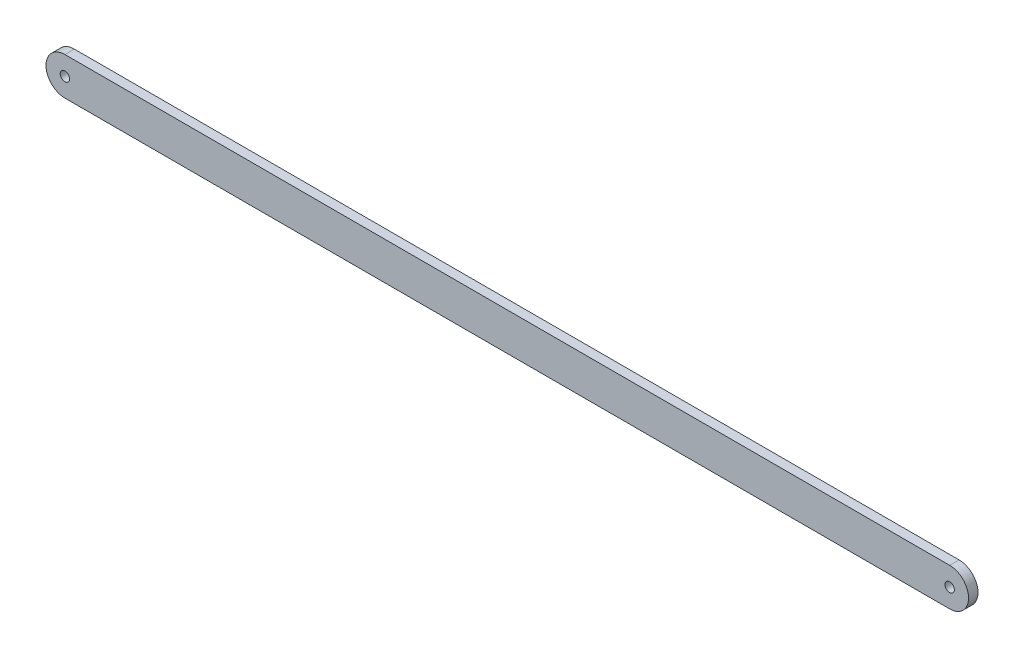
ISO-10303-21;
HEADER;
FILE_DESCRIPTION(('STEP AP214'),'2;1');
FILE_NAME('part.step','',(''),(''),'','','');
FILE_SCHEMA(('AUTOMOTIVE_DESIGN { 1 0 10303 214 1 1 1 1 }'));
ENDSEC;
DATA;
#1=APPLICATION_CONTEXT('core data for automotive mechanical design processes');
#2=APPLICATION_PROTOCOL_DEFINITION('international standard','automotive_design',2000,#1);
#3=PRODUCT_CONTEXT('',#1,'mechanical');
#4=PRODUCT('Part','Part','',(#3));
#5=PRODUCT_RELATED_PRODUCT_CATEGORY('part','',(#4));
#6=PRODUCT_DEFINITION_FORMATION('','',#4);
#7=PRODUCT_DEFINITION_CONTEXT('part definition',#1,'design');
#8=PRODUCT_DEFINITION('design','',#6,#7);
#9=PRODUCT_DEFINITION_SHAPE('','',#8);
#10=(LENGTH_UNIT() NAMED_UNIT(*) SI_UNIT(.MILLI.,.METRE.));
#11=(NAMED_UNIT(*) PLANE_ANGLE_UNIT() SI_UNIT($,.RADIAN.));
#12=(NAMED_UNIT(*) SI_UNIT($,.STERADIAN.) SOLID_ANGLE_UNIT());
#13=UNCERTAINTY_MEASURE_WITH_UNIT(LENGTH_MEASURE(1.E-05),#10,'distance_accuracy_value','');
#14=(GEOMETRIC_REPRESENTATION_CONTEXT(3) GLOBAL_UNCERTAINTY_ASSIGNED_CONTEXT((#13)) GLOBAL_UNIT_ASSIGNED_CONTEXT((#10,
#11,#12)) REPRESENTATION_CONTEXT('',''));
#15=CARTESIAN_POINT('',(0.,0.,0.));
#16=DIRECTION('',(0.,0.,1.));
#17=DIRECTION('',(1.,0.,0.));
#18=AXIS2_PLACEMENT_3D('',#15,#16,#17);
#19=CARTESIAN_POINT('',(-150.,2.22044604925031E-13,1.6));
#20=DIRECTION('',(0.,0.,1.));
#21=DIRECTION('',(1.,0.,0.));
#22=AXIS2_PLACEMENT_3D('',#19,#20,#21);
#23=PLANE('',#22);
#24=CARTESIAN_POINT('',(-150.,2.22044604925031E-13,1.6));
#25=DIRECTION('',(0.,0.,1.));
#26=DIRECTION('',(1.,0.,0.));
#27=AXIS2_PLACEMENT_3D('',#24,#25,#26);
#28=CIRCLE('',#27,1.58750000000007);
#29=CARTESIAN_POINT('',(-148.4125,2.22044604925031E-13,1.6));
#30=VERTEX_POINT('',#29);
#31=EDGE_CURVE('E100',#30,#30,#28,.T.);
#32=ORIENTED_EDGE('',*,*,#31,.F.);
#33=EDGE_LOOP('',(#32));
#34=FACE_BOUND('',#33,.T.);
#35=CARTESIAN_POINT('',(-150.,2.22044604925031E-13,1.6));
#36=DIRECTION('',(0.,0.,1.));
#37=DIRECTION('',(1.,0.,0.));
#38=AXIS2_PLACEMENT_3D('',#35,#36,#37);
#39=CIRCLE('',#38,6.39999999999999);
#40=CARTESIAN_POINT('',(-150.000000000176,6.40000000000018,1.6));
#41=VERTEX_POINT('',#40);
#42=CARTESIAN_POINT('',(-150.000026079066,-6.39999999994667,1.6));
#43=VERTEX_POINT('',#42);
#44=EDGE_CURVE('E85',#41,#43,#39,.T.);
#45=ORIENTED_EDGE('',*,*,#44,.T.);
#46=DIRECTION('',(1.,0.,0.));
#47=VECTOR('',#46,1.);
#48=CARTESIAN_POINT('',(-150.000026079066,-6.39999999994667,1.6));
#49=LINE('',#48,#47);
#50=CARTESIAN_POINT('',(150.000026079047,-6.39999999994662,1.6));
#51=VERTEX_POINT('',#50);
#52=EDGE_CURVE('E80',#43,#51,#49,.T.);
#53=ORIENTED_EDGE('',*,*,#52,.T.);
#54=CARTESIAN_POINT('',(150.000013039602,2.68118860446975E-11,1.6));
#55=DIRECTION('',(0.,0.,1.));
#56=DIRECTION('',(1.,0.,0.));
#57=AXIS2_PLACEMENT_3D('',#54,#55,#56);
#58=CIRCLE('',#57,6.39999999998671);
#59=CARTESIAN_POINT('',(150.000000000156,6.40000000000018,1.6));
#60=VERTEX_POINT('',#59);
#61=EDGE_CURVE('E83',#51,#60,#58,.T.);
#62=ORIENTED_EDGE('',*,*,#61,.T.);
#63=DIRECTION('',(-1.,0.,0.));
#64=VECTOR('',#63,1.);
#65=CARTESIAN_POINT('',(-150.000000000176,6.40000000000018,1.6));
#66=LINE('',#65,#64);
#67=EDGE_CURVE('E50',#60,#41,#66,.T.);
#68=ORIENTED_EDGE('',*,*,#67,.T.);
#69=EDGE_LOOP('',(#45,#53,#62,#68));
#70=FACE_BOUND('',#69,.T.);
#71=CARTESIAN_POINT('',(150.000013039602,2.68118860446975E-11,1.6));
#72=DIRECTION('',(0.,0.,1.));
#73=DIRECTION('',(1.,0.,0.));
#74=AXIS2_PLACEMENT_3D('',#71,#72,#73);
#75=CIRCLE('',#74,1.58749999999984);
#76=CARTESIAN_POINT('',(151.587513039601,2.68118860446975E-11,1.6));
#77=VERTEX_POINT('',#76);
#78=EDGE_CURVE('E115',#77,#77,#75,.T.);
#79=ORIENTED_EDGE('',*,*,#78,.F.);
#80=EDGE_LOOP('',(#79));
#81=FACE_BOUND('',#80,.T.);
#82=ADVANCED_FACE('F33',(#34,#70,#81),#23,.T.);
#83=CARTESIAN_POINT('',(-150.,2.22044604925031E-13,-1.6));
#84=DIRECTION('',(0.,0.,1.));
#85=DIRECTION('',(1.,0.,0.));
#86=AXIS2_PLACEMENT_3D('',#83,#84,#85);
#87=PLANE('',#86);
#88=CARTESIAN_POINT('',(-150.,2.22044604925031E-13,-1.6));
#89=DIRECTION('',(0.,0.,1.));
#90=DIRECTION('',(1.,0.,0.));
#91=AXIS2_PLACEMENT_3D('',#88,#89,#90);
#92=CIRCLE('',#91,6.39999999999999);
#93=CARTESIAN_POINT('',(-150.000000000176,6.40000000000018,-1.6));
#94=VERTEX_POINT('',#93);
#95=CARTESIAN_POINT('',(-150.000026079066,-6.39999999994667,-1.6));
#96=VERTEX_POINT('',#95);
#97=EDGE_CURVE('E97',#94,#96,#92,.T.);
#98=ORIENTED_EDGE('',*,*,#97,.F.);
#99=DIRECTION('',(-1.,0.,0.));
#100=VECTOR('',#99,1.);
#101=CARTESIAN_POINT('',(-150.000000000176,6.40000000000018,-1.6));
#102=LINE('',#101,#100);
#103=CARTESIAN_POINT('',(150.000000000156,6.40000000000018,-1.6));
#104=VERTEX_POINT('',#103);
#105=EDGE_CURVE('E73',#104,#94,#102,.T.);
#106=ORIENTED_EDGE('',*,*,#105,.F.);
#107=CARTESIAN_POINT('',(150.000013039602,2.68118860446975E-11,-1.6));
#108=DIRECTION('',(0.,0.,1.));
#109=DIRECTION('',(1.,0.,0.));
#110=AXIS2_PLACEMENT_3D('',#107,#108,#109);
#111=CIRCLE('',#110,6.39999999998671);
#112=CARTESIAN_POINT('',(150.000026079047,-6.39999999994662,-1.6));
#113=VERTEX_POINT('',#112);
#114=EDGE_CURVE('E67',#113,#104,#111,.T.);
#115=ORIENTED_EDGE('',*,*,#114,.F.);
#116=DIRECTION('',(1.,0.,0.));
#117=VECTOR('',#116,1.);
#118=CARTESIAN_POINT('',(-150.000026079066,-6.39999999994667,-1.6));
#119=LINE('',#118,#117);
#120=EDGE_CURVE('E89',#96,#113,#119,.T.);
#121=ORIENTED_EDGE('',*,*,#120,.F.);
#122=EDGE_LOOP('',(#98,#106,#115,#121));
#123=FACE_BOUND('',#122,.T.);
#124=CARTESIAN_POINT('',(-150.,2.22044604925031E-13,-1.6));
#125=DIRECTION('',(0.,0.,1.));
#126=DIRECTION('',(1.,0.,0.));
#127=AXIS2_PLACEMENT_3D('',#124,#125,#126);
#128=CIRCLE('',#127,1.58750000000007);
#129=CARTESIAN_POINT('',(-148.4125,2.22044604925031E-13,-1.6));
#130=VERTEX_POINT('',#129);
#131=EDGE_CURVE('E112',#130,#130,#128,.T.);
#132=ORIENTED_EDGE('',*,*,#131,.T.);
#133=EDGE_LOOP('',(#132));
#134=FACE_BOUND('',#133,.T.);
#135=CARTESIAN_POINT('',(150.000013039602,2.68118860446975E-11,-1.6));
#136=DIRECTION('',(0.,0.,1.));
#137=DIRECTION('',(1.,0.,0.));
#138=AXIS2_PLACEMENT_3D('',#135,#136,#137);
#139=CIRCLE('',#138,1.58749999999984);
#140=CARTESIAN_POINT('',(151.587513039601,2.68118860446975E-11,-1.6));
#141=VERTEX_POINT('',#140);
#142=EDGE_CURVE('E118',#141,#141,#139,.T.);
#143=ORIENTED_EDGE('',*,*,#142,.T.);
#144=EDGE_LOOP('',(#143));
#145=FACE_BOUND('',#144,.T.);
#146=ADVANCED_FACE('F108',(#123,#134,#145),#87,.F.);
#147=CARTESIAN_POINT('',(-150.,2.22044604925031E-13,1.6));
#148=DIRECTION('',(0.,0.,-1.));
#149=DIRECTION('',(-1.,0.,0.));
#150=AXIS2_PLACEMENT_3D('',#147,#148,#149);
#151=CYLINDRICAL_SURFACE('',#150,6.39999999999999);
#152=ORIENTED_EDGE('',*,*,#97,.T.);
#153=DIRECTION('',(0.,0.,-1.));
#154=VECTOR('',#153,1.);
#155=CARTESIAN_POINT('',(-150.000026079066,-6.39999999994667,1.6));
#156=LINE('',#155,#154);
#157=EDGE_CURVE('E11',#43,#96,#156,.T.);
#158=ORIENTED_EDGE('',*,*,#157,.F.);
#159=ORIENTED_EDGE('',*,*,#44,.F.);
#160=DIRECTION('',(0.,0.,-1.));
#161=VECTOR('',#160,1.);
#162=CARTESIAN_POINT('',(-150.000000000176,6.40000000000018,1.6));
#163=LINE('',#162,#161);
#164=EDGE_CURVE('E93',#41,#94,#163,.T.);
#165=ORIENTED_EDGE('',*,*,#164,.T.);
#166=EDGE_LOOP('',(#152,#158,#159,#165));
#167=FACE_BOUND('',#166,.T.);
#168=ADVANCED_FACE('F35',(#167),#151,.T.);
#169=CARTESIAN_POINT('',(-150.000026079066,-6.39999999994667,1.6));
#170=DIRECTION('',(0.,1.,0.));
#171=DIRECTION('',(0.,0.,1.));
#172=AXIS2_PLACEMENT_3D('',#169,#170,#171);
#173=PLANE('',#172);
#174=ORIENTED_EDGE('',*,*,#120,.T.);
#175=DIRECTION('',(0.,0.,-1.));
#176=VECTOR('',#175,1.);
#177=CARTESIAN_POINT('',(150.000026079047,-6.39999999994662,1.6));
#178=LINE('',#177,#176);
#179=EDGE_CURVE('E42',#51,#113,#178,.T.);
#180=ORIENTED_EDGE('',*,*,#179,.F.);
#181=ORIENTED_EDGE('',*,*,#52,.F.);
#182=ORIENTED_EDGE('',*,*,#157,.T.);
#183=EDGE_LOOP('',(#174,#180,#181,#182));
#184=FACE_BOUND('',#183,.T.);
#185=ADVANCED_FACE('F88',(#184),#173,.F.);
#186=CARTESIAN_POINT('',(150.000013039602,2.68118860446975E-11,1.6));
#187=DIRECTION('',(0.,0.,-1.));
#188=DIRECTION('',(-1.,0.,0.));
#189=AXIS2_PLACEMENT_3D('',#186,#187,#188);
#190=CYLINDRICAL_SURFACE('',#189,6.39999999998671);
#191=ORIENTED_EDGE('',*,*,#114,.T.);
#192=DIRECTION('',(0.,0.,-1.));
#193=VECTOR('',#192,1.);
#194=CARTESIAN_POINT('',(150.000000000156,6.40000000000018,1.6));
#195=LINE('',#194,#193);
#196=EDGE_CURVE('E90',#60,#104,#195,.T.);
#197=ORIENTED_EDGE('',*,*,#196,.F.);
#198=ORIENTED_EDGE('',*,*,#61,.F.);
#199=ORIENTED_EDGE('',*,*,#179,.T.);
#200=EDGE_LOOP('',(#191,#197,#198,#199));
#201=FACE_BOUND('',#200,.T.);
#202=ADVANCED_FACE('F91',(#201),#190,.T.);
#203=CARTESIAN_POINT('',(-150.000000000176,6.40000000000018,1.6));
#204=DIRECTION('',(0.,-1.,0.));
#205=DIRECTION('',(0.,0.,-1.));
#206=AXIS2_PLACEMENT_3D('',#203,#204,#205);
#207=PLANE('',#206);
#208=ORIENTED_EDGE('',*,*,#105,.T.);
#209=ORIENTED_EDGE('',*,*,#164,.F.);
#210=ORIENTED_EDGE('',*,*,#67,.F.);
#211=ORIENTED_EDGE('',*,*,#196,.T.);
#212=EDGE_LOOP('',(#208,#209,#210,#211));
#213=FACE_BOUND('',#212,.T.);
#214=ADVANCED_FACE('F105',(#213),#207,.F.);
#215=CARTESIAN_POINT('',(-150.,2.22044604925031E-13,1.6));
#216=DIRECTION('',(0.,0.,-1.));
#217=DIRECTION('',(-1.,0.,0.));
#218=AXIS2_PLACEMENT_3D('',#215,#216,#217);
#219=CYLINDRICAL_SURFACE('',#218,1.58750000000007);
#220=ORIENTED_EDGE('',*,*,#31,.T.);
#221=EDGE_LOOP('',(#220));
#222=FACE_BOUND('',#221,.T.);
#223=ORIENTED_EDGE('',*,*,#131,.F.);
#224=EDGE_LOOP('',(#223));
#225=FACE_BOUND('',#224,.T.);
#226=ADVANCED_FACE('F135',(#222,#225),#219,.F.);
#227=CARTESIAN_POINT('',(150.000013039602,2.68118860446975E-11,1.6));
#228=DIRECTION('',(0.,0.,-1.));
#229=DIRECTION('',(-1.,0.,0.));
#230=AXIS2_PLACEMENT_3D('',#227,#228,#229);
#231=CYLINDRICAL_SURFACE('',#230,1.58749999999984);
#232=ORIENTED_EDGE('',*,*,#78,.T.);
#233=EDGE_LOOP('',(#232));
#234=FACE_BOUND('',#233,.T.);
#235=ORIENTED_EDGE('',*,*,#142,.F.);
#236=EDGE_LOOP('',(#235));
#237=FACE_BOUND('',#236,.T.);
#238=ADVANCED_FACE('F124',(#234,#237),#231,.F.);
#239=CLOSED_SHELL('',(#82,#146,#168,#185,#202,#214,#226,#238));
#240=MANIFOLD_SOLID_BREP('B2',#239);
#241=ADVANCED_BREP_SHAPE_REPRESENTATION('',(#18,#240),#14);
#242=SHAPE_DEFINITION_REPRESENTATION(#9,#241);
ENDSEC;
END-ISO-10303-21;
